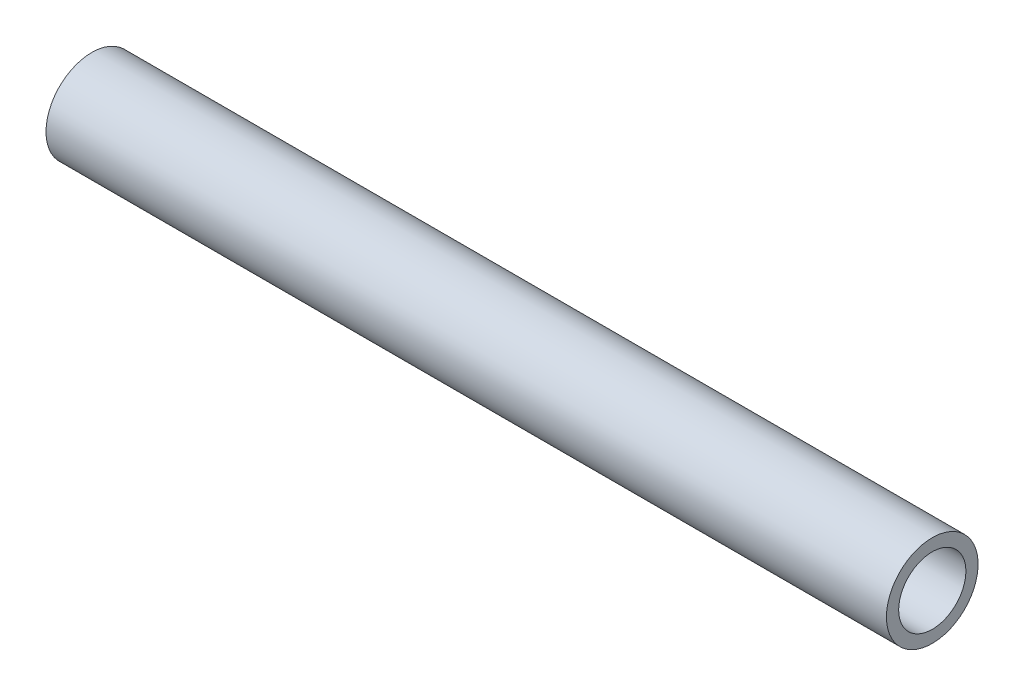
ISO-10303-21;
HEADER;
FILE_DESCRIPTION(('STEP AP214'),'2;1');
FILE_NAME('part.step','',(''),(''),'','','');
FILE_SCHEMA(('AUTOMOTIVE_DESIGN { 1 0 10303 214 1 1 1 1 }'));
ENDSEC;
DATA;
#1=APPLICATION_CONTEXT('core data for automotive mechanical design processes');
#2=APPLICATION_PROTOCOL_DEFINITION('international standard','automotive_design',2000,#1);
#3=PRODUCT_CONTEXT('',#1,'mechanical');
#4=PRODUCT('Part','Part','',(#3));
#5=PRODUCT_RELATED_PRODUCT_CATEGORY('part','',(#4));
#6=PRODUCT_DEFINITION_FORMATION('','',#4);
#7=PRODUCT_DEFINITION_CONTEXT('part definition',#1,'design');
#8=PRODUCT_DEFINITION('design','',#6,#7);
#9=PRODUCT_DEFINITION_SHAPE('','',#8);
#10=(LENGTH_UNIT() NAMED_UNIT(*) SI_UNIT(.MILLI.,.METRE.));
#11=(NAMED_UNIT(*) PLANE_ANGLE_UNIT() SI_UNIT($,.RADIAN.));
#12=(NAMED_UNIT(*) SI_UNIT($,.STERADIAN.) SOLID_ANGLE_UNIT());
#13=UNCERTAINTY_MEASURE_WITH_UNIT(LENGTH_MEASURE(1.E-05),#10,'distance_accuracy_value','');
#14=(GEOMETRIC_REPRESENTATION_CONTEXT(3) GLOBAL_UNCERTAINTY_ASSIGNED_CONTEXT((#13)) GLOBAL_UNIT_ASSIGNED_CONTEXT((#10,
#11,#12)) REPRESENTATION_CONTEXT('',''));
#15=CARTESIAN_POINT('',(0.,0.,0.));
#16=DIRECTION('',(0.,0.,1.));
#17=DIRECTION('',(1.,0.,0.));
#18=AXIS2_PLACEMENT_3D('',#15,#16,#17);
#19=CARTESIAN_POINT('',(0.,2.25,0.));
#20=DIRECTION('',(1.,0.,0.));
#21=DIRECTION('',(0.,0.,-1.));
#22=AXIS2_PLACEMENT_3D('',#19,#20,#21);
#23=PLANE('',#22);
#24=CARTESIAN_POINT('',(0.,0.,0.));
#25=DIRECTION('',(-1.,0.,0.));
#26=DIRECTION('',(0.,0.,1.));
#27=AXIS2_PLACEMENT_3D('',#24,#25,#26);
#28=CIRCLE('',#27,1.65);
#29=CARTESIAN_POINT('',(0.,0.,1.65));
#30=VERTEX_POINT('',#29);
#31=EDGE_CURVE('E10',#30,#30,#28,.T.);
#32=ORIENTED_EDGE('',*,*,#31,.F.);
#33=EDGE_LOOP('',(#32));
#34=FACE_BOUND('',#33,.T.);
#35=CARTESIAN_POINT('',(0.,0.,0.));
#36=DIRECTION('',(-1.,0.,0.));
#37=DIRECTION('',(0.,0.,1.));
#38=AXIS2_PLACEMENT_3D('',#35,#36,#37);
#39=CIRCLE('',#38,2.25);
#40=CARTESIAN_POINT('',(0.,0.,2.25));
#41=VERTEX_POINT('',#40);
#42=EDGE_CURVE('E45',#41,#41,#39,.T.);
#43=ORIENTED_EDGE('',*,*,#42,.T.);
#44=EDGE_LOOP('',(#43));
#45=FACE_BOUND('',#44,.T.);
#46=ADVANCED_FACE('F31',(#34,#45),#23,.F.);
#47=CARTESIAN_POINT('',(-110.,0.,0.));
#48=DIRECTION('',(-1.,0.,0.));
#49=DIRECTION('',(0.,0.,1.));
#50=AXIS2_PLACEMENT_3D('',#47,#48,#49);
#51=CYLINDRICAL_SURFACE('',#50,1.65);
#52=CARTESIAN_POINT('',(41.2666884641835,0.,0.));
#53=DIRECTION('',(-1.,0.,0.));
#54=DIRECTION('',(0.,0.,1.));
#55=AXIS2_PLACEMENT_3D('',#52,#53,#54);
#56=CIRCLE('',#55,1.65);
#57=CARTESIAN_POINT('',(41.2666884641835,0.,1.65));
#58=VERTEX_POINT('',#57);
#59=EDGE_CURVE('E37',#58,#58,#56,.T.);
#60=ORIENTED_EDGE('',*,*,#59,.F.);
#61=EDGE_LOOP('',(#60));
#62=FACE_BOUND('',#61,.T.);
#63=ORIENTED_EDGE('',*,*,#31,.T.);
#64=EDGE_LOOP('',(#63));
#65=FACE_BOUND('',#64,.T.);
#66=ADVANCED_FACE('F60',(#62,#65),#51,.F.);
#67=CARTESIAN_POINT('',(41.2666884641835,1.65,0.));
#68=DIRECTION('',(-1.,0.,0.));
#69=DIRECTION('',(0.,0.,1.));
#70=AXIS2_PLACEMENT_3D('',#67,#68,#69);
#71=PLANE('',#70);
#72=CARTESIAN_POINT('',(41.2666884641835,0.,0.));
#73=DIRECTION('',(-1.,0.,0.));
#74=DIRECTION('',(0.,0.,1.));
#75=AXIS2_PLACEMENT_3D('',#72,#73,#74);
#76=CIRCLE('',#75,2.25);
#77=CARTESIAN_POINT('',(41.2666884641835,0.,2.25));
#78=VERTEX_POINT('',#77);
#79=EDGE_CURVE('E41',#78,#78,#76,.T.);
#80=ORIENTED_EDGE('',*,*,#79,.F.);
#81=EDGE_LOOP('',(#80));
#82=FACE_BOUND('',#81,.T.);
#83=ORIENTED_EDGE('',*,*,#59,.T.);
#84=EDGE_LOOP('',(#83));
#85=FACE_BOUND('',#84,.T.);
#86=ADVANCED_FACE('F55',(#82,#85),#71,.F.);
#87=CARTESIAN_POINT('',(-110.,0.,0.));
#88=DIRECTION('',(-1.,0.,0.));
#89=DIRECTION('',(0.,0.,1.));
#90=AXIS2_PLACEMENT_3D('',#87,#88,#89);
#91=CYLINDRICAL_SURFACE('',#90,2.25);
#92=ORIENTED_EDGE('',*,*,#42,.F.);
#93=EDGE_LOOP('',(#92));
#94=FACE_BOUND('',#93,.T.);
#95=ORIENTED_EDGE('',*,*,#79,.T.);
#96=EDGE_LOOP('',(#95));
#97=FACE_BOUND('',#96,.T.);
#98=ADVANCED_FACE('F52',(#94,#97),#91,.T.);
#99=CLOSED_SHELL('',(#46,#66,#86,#98));
#100=MANIFOLD_SOLID_BREP('B2',#99);
#101=ADVANCED_BREP_SHAPE_REPRESENTATION('',(#18,#100),#14);
#102=SHAPE_DEFINITION_REPRESENTATION(#9,#101);
ENDSEC;
END-ISO-10303-21;
